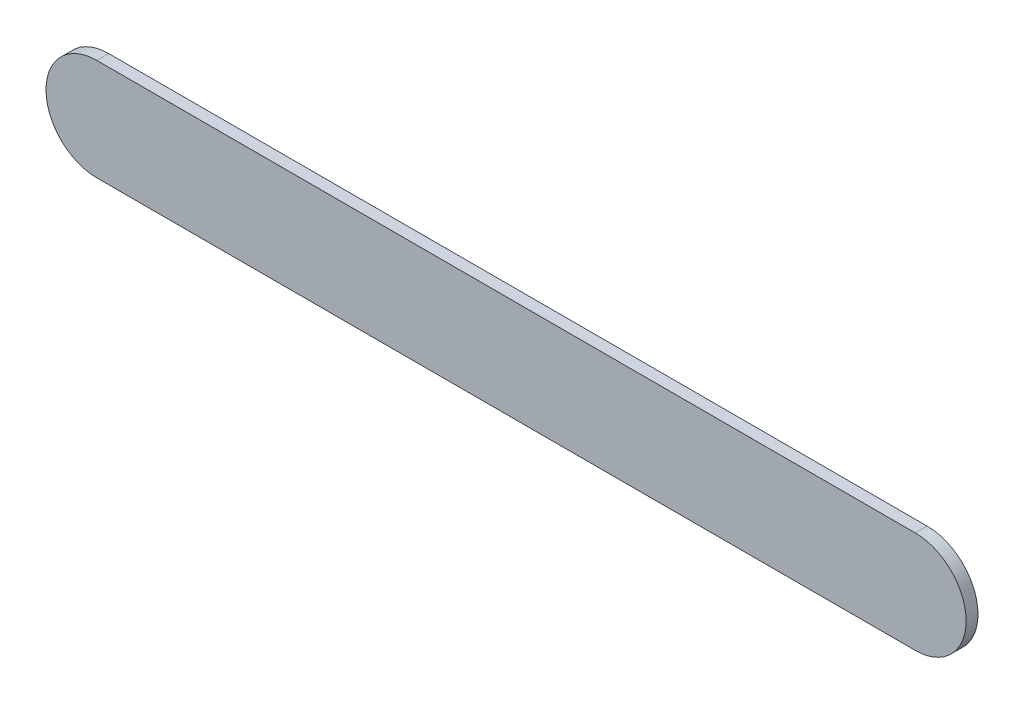
ISO-10303-21;
HEADER;
FILE_DESCRIPTION(('STEP AP214'),'2;1');
FILE_NAME('part.step','',(''),(''),'','','');
FILE_SCHEMA(('AUTOMOTIVE_DESIGN { 1 0 10303 214 1 1 1 1 }'));
ENDSEC;
DATA;
#1=APPLICATION_CONTEXT('core data for automotive mechanical design processes');
#2=APPLICATION_PROTOCOL_DEFINITION('international standard','automotive_design',2000,#1);
#3=PRODUCT_CONTEXT('',#1,'mechanical');
#4=PRODUCT('Part','Part','',(#3));
#5=PRODUCT_RELATED_PRODUCT_CATEGORY('part','',(#4));
#6=PRODUCT_DEFINITION_FORMATION('','',#4);
#7=PRODUCT_DEFINITION_CONTEXT('part definition',#1,'design');
#8=PRODUCT_DEFINITION('design','',#6,#7);
#9=PRODUCT_DEFINITION_SHAPE('','',#8);
#10=(LENGTH_UNIT() NAMED_UNIT(*) SI_UNIT(.MILLI.,.METRE.));
#11=(NAMED_UNIT(*) PLANE_ANGLE_UNIT() SI_UNIT($,.RADIAN.));
#12=(NAMED_UNIT(*) SI_UNIT($,.STERADIAN.) SOLID_ANGLE_UNIT());
#13=UNCERTAINTY_MEASURE_WITH_UNIT(LENGTH_MEASURE(1.E-05),#10,'distance_accuracy_value','');
#14=(GEOMETRIC_REPRESENTATION_CONTEXT(3) GLOBAL_UNCERTAINTY_ASSIGNED_CONTEXT((#13)) GLOBAL_UNIT_ASSIGNED_CONTEXT((#10,
#11,#12)) REPRESENTATION_CONTEXT('',''));
#15=CARTESIAN_POINT('',(0.,0.,0.));
#16=DIRECTION('',(0.,0.,1.));
#17=DIRECTION('',(1.,0.,0.));
#18=AXIS2_PLACEMENT_3D('',#15,#16,#17);
#19=CARTESIAN_POINT('',(123.0875,-67.65,1.635));
#20=DIRECTION('',(0.,0.,1.));
#21=DIRECTION('',(1.,0.,0.));
#22=AXIS2_PLACEMENT_3D('',#19,#20,#21);
#23=PLANE('',#22);
#24=DIRECTION('',(1.,0.,0.));
#25=VECTOR('',#24,1.);
#26=CARTESIAN_POINT('',(123.0875,-67.65,1.635));
#27=LINE('',#26,#25);
#28=CARTESIAN_POINT('',(123.0875,-67.65,1.635));
#29=VERTEX_POINT('',#28);
#30=CARTESIAN_POINT('',(125.5,-67.65,1.635));
#31=VERTEX_POINT('',#30);
#32=EDGE_CURVE('E83',#29,#31,#27,.T.);
#33=ORIENTED_EDGE('',*,*,#32,.T.);
#34=CARTESIAN_POINT('',(125.5,-67.5,1.635));
#35=DIRECTION('',(0.,0.,1.));
#36=DIRECTION('',(0.,-1.,0.));
#37=AXIS2_PLACEMENT_3D('',#34,#35,#36);
#38=CIRCLE('',#37,0.15);
#39=CARTESIAN_POINT('',(125.5,-67.35,1.635));
#40=VERTEX_POINT('',#39);
#41=EDGE_CURVE('E104',#31,#40,#38,.T.);
#42=ORIENTED_EDGE('',*,*,#41,.T.);
#43=DIRECTION('',(-1.,0.,0.));
#44=VECTOR('',#43,1.);
#45=CARTESIAN_POINT('',(125.5,-67.35,1.635));
#46=LINE('',#45,#44);
#47=CARTESIAN_POINT('',(123.0875,-67.35,1.635));
#48=VERTEX_POINT('',#47);
#49=EDGE_CURVE('E75',#40,#48,#46,.T.);
#50=ORIENTED_EDGE('',*,*,#49,.T.);
#51=CARTESIAN_POINT('',(123.0875,-67.5,1.635));
#52=DIRECTION('',(0.,0.,1.));
#53=DIRECTION('',(0.,1.,0.));
#54=AXIS2_PLACEMENT_3D('',#51,#52,#53);
#55=CIRCLE('',#54,0.15);
#56=EDGE_CURVE('E11',#48,#29,#55,.T.);
#57=ORIENTED_EDGE('',*,*,#56,.T.);
#58=EDGE_LOOP('',(#33,#42,#50,#57));
#59=FACE_BOUND('',#58,.T.);
#60=ADVANCED_FACE('F17',(#59),#23,.T.);
#61=CARTESIAN_POINT('',(123.0875,-67.65,1.6));
#62=DIRECTION('',(0.,0.,1.));
#63=DIRECTION('',(1.,0.,0.));
#64=AXIS2_PLACEMENT_3D('',#61,#62,#63);
#65=PLANE('',#64);
#66=CARTESIAN_POINT('',(123.0875,-67.5,1.6));
#67=DIRECTION('',(0.,0.,1.));
#68=DIRECTION('',(0.,1.,0.));
#69=AXIS2_PLACEMENT_3D('',#66,#67,#68);
#70=CIRCLE('',#69,0.15);
#71=CARTESIAN_POINT('',(123.0875,-67.35,1.6));
#72=VERTEX_POINT('',#71);
#73=CARTESIAN_POINT('',(123.0875,-67.65,1.6));
#74=VERTEX_POINT('',#73);
#75=EDGE_CURVE('E26',#72,#74,#70,.T.);
#76=ORIENTED_EDGE('',*,*,#75,.F.);
#77=DIRECTION('',(-1.,0.,0.));
#78=VECTOR('',#77,1.);
#79=CARTESIAN_POINT('',(125.5,-67.35,1.6));
#80=LINE('',#79,#78);
#81=CARTESIAN_POINT('',(125.5,-67.35,1.6));
#82=VERTEX_POINT('',#81);
#83=EDGE_CURVE('E100',#82,#72,#80,.T.);
#84=ORIENTED_EDGE('',*,*,#83,.F.);
#85=CARTESIAN_POINT('',(125.5,-67.5,1.6));
#86=DIRECTION('',(0.,0.,1.));
#87=DIRECTION('',(0.,-1.,0.));
#88=AXIS2_PLACEMENT_3D('',#85,#86,#87);
#89=CIRCLE('',#88,0.15);
#90=CARTESIAN_POINT('',(125.5,-67.65,1.6));
#91=VERTEX_POINT('',#90);
#92=EDGE_CURVE('E85',#91,#82,#89,.T.);
#93=ORIENTED_EDGE('',*,*,#92,.F.);
#94=DIRECTION('',(1.,0.,0.));
#95=VECTOR('',#94,1.);
#96=CARTESIAN_POINT('',(123.0875,-67.65,1.6));
#97=LINE('',#96,#95);
#98=EDGE_CURVE('E81',#74,#91,#97,.T.);
#99=ORIENTED_EDGE('',*,*,#98,.F.);
#100=EDGE_LOOP('',(#76,#84,#93,#99));
#101=FACE_BOUND('',#100,.T.);
#102=ADVANCED_FACE('F19',(#101),#65,.F.);
#103=CARTESIAN_POINT('',(123.0875,-67.5,1.6));
#104=DIRECTION('',(0.,0.,-1.));
#105=DIRECTION('',(0.,1.,0.));
#106=AXIS2_PLACEMENT_3D('',#103,#104,#105);
#107=CYLINDRICAL_SURFACE('',#106,0.15);
#108=ORIENTED_EDGE('',*,*,#75,.T.);
#109=DIRECTION('',(0.,0.,1.));
#110=VECTOR('',#109,1.);
#111=CARTESIAN_POINT('',(123.0875,-67.65,1.6));
#112=LINE('',#111,#110);
#113=EDGE_CURVE('E69',#74,#29,#112,.T.);
#114=ORIENTED_EDGE('',*,*,#113,.T.);
#115=ORIENTED_EDGE('',*,*,#56,.F.);
#116=DIRECTION('',(0.,0.,1.));
#117=VECTOR('',#116,1.);
#118=CARTESIAN_POINT('',(123.0875,-67.35,1.6));
#119=LINE('',#118,#117);
#120=EDGE_CURVE('E72',#72,#48,#119,.T.);
#121=ORIENTED_EDGE('',*,*,#120,.F.);
#122=EDGE_LOOP('',(#108,#114,#115,#121));
#123=FACE_BOUND('',#122,.T.);
#124=ADVANCED_FACE('F68',(#123),#107,.T.);
#125=CARTESIAN_POINT('',(125.5,-67.35,1.6));
#126=DIRECTION('',(0.,-1.,0.));
#127=DIRECTION('',(0.,0.,-1.));
#128=AXIS2_PLACEMENT_3D('',#125,#126,#127);
#129=PLANE('',#128);
#130=ORIENTED_EDGE('',*,*,#83,.T.);
#131=ORIENTED_EDGE('',*,*,#120,.T.);
#132=ORIENTED_EDGE('',*,*,#49,.F.);
#133=DIRECTION('',(0.,0.,1.));
#134=VECTOR('',#133,1.);
#135=CARTESIAN_POINT('',(125.5,-67.35,1.6));
#136=LINE('',#135,#134);
#137=EDGE_CURVE('E101',#82,#40,#136,.T.);
#138=ORIENTED_EDGE('',*,*,#137,.F.);
#139=EDGE_LOOP('',(#130,#131,#132,#138));
#140=FACE_BOUND('',#139,.T.);
#141=ADVANCED_FACE('F120',(#140),#129,.F.);
#142=CARTESIAN_POINT('',(125.5,-67.5,1.6));
#143=DIRECTION('',(0.,0.,-1.));
#144=DIRECTION('',(0.,-1.,0.));
#145=AXIS2_PLACEMENT_3D('',#142,#143,#144);
#146=CYLINDRICAL_SURFACE('',#145,0.15);
#147=ORIENTED_EDGE('',*,*,#92,.T.);
#148=ORIENTED_EDGE('',*,*,#137,.T.);
#149=ORIENTED_EDGE('',*,*,#41,.F.);
#150=DIRECTION('',(0.,0.,1.));
#151=VECTOR('',#150,1.);
#152=CARTESIAN_POINT('',(125.5,-67.65,1.6));
#153=LINE('',#152,#151);
#154=EDGE_CURVE('E90',#91,#31,#153,.T.);
#155=ORIENTED_EDGE('',*,*,#154,.F.);
#156=EDGE_LOOP('',(#147,#148,#149,#155));
#157=FACE_BOUND('',#156,.T.);
#158=ADVANCED_FACE('F122',(#157),#146,.T.);
#159=CARTESIAN_POINT('',(123.0875,-67.65,1.6));
#160=DIRECTION('',(0.,1.,0.));
#161=DIRECTION('',(1.,0.,0.));
#162=AXIS2_PLACEMENT_3D('',#159,#160,#161);
#163=PLANE('',#162);
#164=ORIENTED_EDGE('',*,*,#98,.T.);
#165=ORIENTED_EDGE('',*,*,#154,.T.);
#166=ORIENTED_EDGE('',*,*,#32,.F.);
#167=ORIENTED_EDGE('',*,*,#113,.F.);
#168=EDGE_LOOP('',(#164,#165,#166,#167));
#169=FACE_BOUND('',#168,.T.);
#170=ADVANCED_FACE('F79',(#169),#163,.F.);
#171=CLOSED_SHELL('',(#60,#102,#124,#141,#158,#170));
#172=MANIFOLD_SOLID_BREP('B1',#171);
#173=ADVANCED_BREP_SHAPE_REPRESENTATION('',(#18,#172),#14);
#174=SHAPE_DEFINITION_REPRESENTATION(#9,#173);
ENDSEC;
END-ISO-10303-21;
